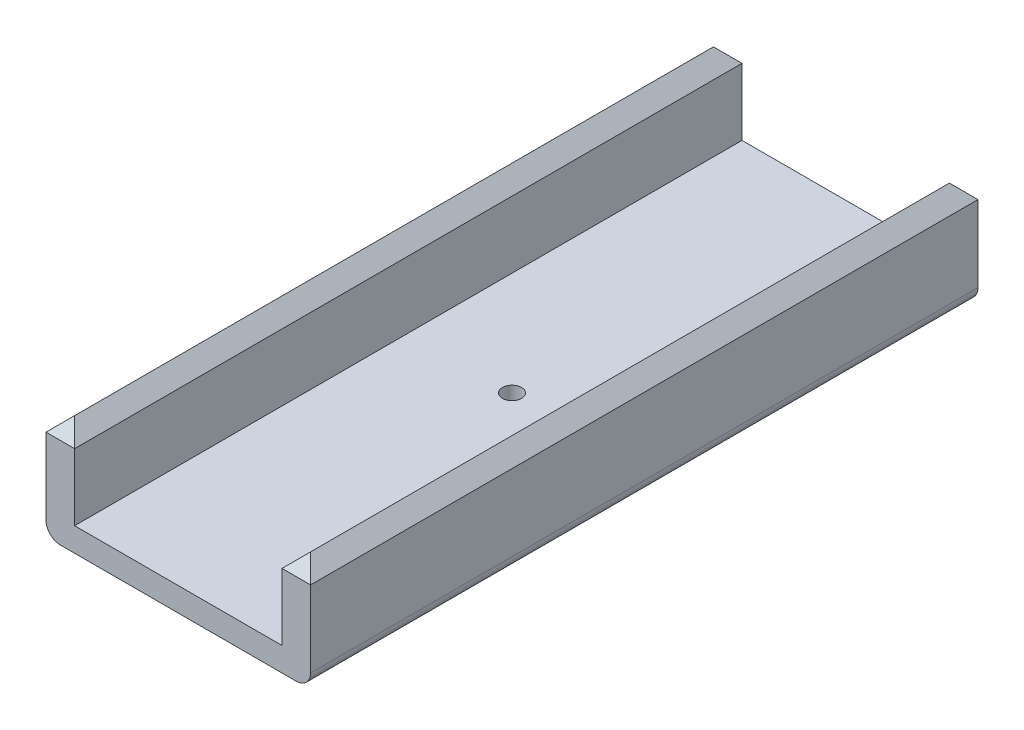
ISO-10303-21;
HEADER;
FILE_DESCRIPTION(('STEP AP214'),'2;1');
FILE_NAME('part.step','',(''),(''),'','','');
FILE_SCHEMA(('AUTOMOTIVE_DESIGN { 1 0 10303 214 1 1 1 1 }'));
ENDSEC;
DATA;
#1=APPLICATION_CONTEXT('core data for automotive mechanical design processes');
#2=APPLICATION_PROTOCOL_DEFINITION('international standard','automotive_design',2000,#1);
#3=PRODUCT_CONTEXT('',#1,'mechanical');
#4=PRODUCT('Part','Part','',(#3));
#5=PRODUCT_RELATED_PRODUCT_CATEGORY('part','',(#4));
#6=PRODUCT_DEFINITION_FORMATION('','',#4);
#7=PRODUCT_DEFINITION_CONTEXT('part definition',#1,'design');
#8=PRODUCT_DEFINITION('design','',#6,#7);
#9=PRODUCT_DEFINITION_SHAPE('','',#8);
#10=(LENGTH_UNIT() NAMED_UNIT(*) SI_UNIT(.MILLI.,.METRE.));
#11=(NAMED_UNIT(*) PLANE_ANGLE_UNIT() SI_UNIT($,.RADIAN.));
#12=(NAMED_UNIT(*) SI_UNIT($,.STERADIAN.) SOLID_ANGLE_UNIT());
#13=UNCERTAINTY_MEASURE_WITH_UNIT(LENGTH_MEASURE(1.E-05),#10,'distance_accuracy_value','');
#14=(GEOMETRIC_REPRESENTATION_CONTEXT(3) GLOBAL_UNCERTAINTY_ASSIGNED_CONTEXT((#13)) GLOBAL_UNIT_ASSIGNED_CONTEXT((#10,
#11,#12)) REPRESENTATION_CONTEXT('',''));
#15=CARTESIAN_POINT('',(0.,0.,0.));
#16=DIRECTION('',(0.,0.,1.));
#17=DIRECTION('',(1.,0.,0.));
#18=AXIS2_PLACEMENT_3D('',#15,#16,#17);
#19=CARTESIAN_POINT('',(-21.75,6.50000000000006,75.));
#20=DIRECTION('',(-0.707106781186547,-0.707106781186548,0.));
#21=DIRECTION('',(0.,0.,1.));
#22=AXIS2_PLACEMENT_3D('',#19,#20,#21);
#23=PLANE('',#22);
#24=DIRECTION('',(0.577350269189626,-0.577350269189625,-0.577350269189626));
#25=VECTOR('',#24,1.);
#26=CARTESIAN_POINT('',(-70.0833333333334,54.8333333333333,-21.6666666666665));
#27=LINE('',#26,#25);
#28=CARTESIAN_POINT('',(-21.75,6.50000000000006,-70.0000000000001));
#29=VERTEX_POINT('',#28);
#30=CARTESIAN_POINT('',(-24.75,9.50000000000006,-66.9999999999999));
#31=VERTEX_POINT('',#30);
#32=EDGE_CURVE('E264',#29,#31,#27,.F.);
#33=ORIENTED_EDGE('',*,*,#32,.T.);
#34=DIRECTION('',(0.,0.,1.));
#35=VECTOR('',#34,1.);
#36=CARTESIAN_POINT('',(-24.75,9.50000000000006,75.));
#37=LINE('',#36,#35);
#38=CARTESIAN_POINT('',(-24.75,9.50000000000006,66.9999999999999));
#39=VERTEX_POINT('',#38);
#40=EDGE_CURVE('E60',#31,#39,#37,.T.);
#41=ORIENTED_EDGE('',*,*,#40,.T.);
#42=DIRECTION('',(0.577350269189626,-0.577350269189625,0.577350269189626));
#43=VECTOR('',#42,1.);
#44=CARTESIAN_POINT('',(-20.0833333333333,4.83333333333336,71.6666666666668));
#45=LINE('',#44,#43);
#46=CARTESIAN_POINT('',(-21.75,6.50000000000006,70.0000000000001));
#47=VERTEX_POINT('',#46);
#48=EDGE_CURVE('E276',#47,#39,#45,.F.);
#49=ORIENTED_EDGE('',*,*,#48,.F.);
#50=DIRECTION('',(0.,0.,1.));
#51=VECTOR('',#50,1.);
#52=CARTESIAN_POINT('',(-21.75,6.50000000000006,75.));
#53=LINE('',#52,#51);
#54=EDGE_CURVE('E260',#29,#47,#53,.T.);
#55=ORIENTED_EDGE('',*,*,#54,.F.);
#56=EDGE_LOOP('',(#33,#41,#49,#55));
#57=FACE_BOUND('',#56,.T.);
#58=ADVANCED_FACE('F50',(#57),#23,.F.);
#59=CARTESIAN_POINT('',(-27.75,12.5,-64.0000000000001));
#60=DIRECTION('',(0.,0.707106781186548,-0.707106781186547));
#61=DIRECTION('',(1.,0.,0.));
#62=AXIS2_PLACEMENT_3D('',#59,#60,#61);
#63=PLANE('',#62);
#64=DIRECTION('',(-0.577350269189626,-0.577350269189625,-0.577350269189626));
#65=VECTOR('',#64,1.);
#66=CARTESIAN_POINT('',(-23.75,10.5,-66.0000000000001));
#67=LINE('',#66,#65);
#68=CARTESIAN_POINT('',(-27.75,6.50000000000006,-70.0000000000001));
#69=VERTEX_POINT('',#68);
#70=EDGE_CURVE('E284',#31,#69,#67,.T.);
#71=ORIENTED_EDGE('',*,*,#70,.F.);
#72=ORIENTED_EDGE('',*,*,#32,.F.);
#73=DIRECTION('',(1.,0.,0.));
#74=VECTOR('',#73,1.);
#75=CARTESIAN_POINT('',(-21.75,6.50000000000006,-70.0000000000001));
#76=LINE('',#75,#74);
#77=EDGE_CURVE('E234',#69,#29,#76,.T.);
#78=ORIENTED_EDGE('',*,*,#77,.F.);
#79=EDGE_LOOP('',(#71,#72,#78));
#80=FACE_BOUND('',#79,.T.);
#81=ADVANCED_FACE('F49',(#80),#63,.T.);
#82=CARTESIAN_POINT('',(-27.75,6.50000000000006,70.0000000000001));
#83=DIRECTION('',(0.707106781186547,-0.707106781186548,0.));
#84=DIRECTION('',(0.,0.,-1.));
#85=AXIS2_PLACEMENT_3D('',#82,#83,#84);
#86=PLANE('',#85);
#87=ORIENTED_EDGE('',*,*,#40,.F.);
#88=ORIENTED_EDGE('',*,*,#70,.T.);
#89=DIRECTION('',(0.,0.,-1.));
#90=VECTOR('',#89,1.);
#91=CARTESIAN_POINT('',(-27.75,6.50000000000006,70.0000000000001));
#92=LINE('',#91,#90);
#93=CARTESIAN_POINT('',(-27.75,6.50000000000006,70.0000000000001));
#94=VERTEX_POINT('',#93);
#95=EDGE_CURVE('E255',#94,#69,#92,.T.);
#96=ORIENTED_EDGE('',*,*,#95,.F.);
#97=DIRECTION('',(0.577350269189626,0.577350269189625,-0.577350269189626));
#98=VECTOR('',#97,1.);
#99=CARTESIAN_POINT('',(-27.75,6.50000000000006,70.0000000000001));
#100=LINE('',#99,#98);
#101=EDGE_CURVE('E277',#39,#94,#100,.F.);
#102=ORIENTED_EDGE('',*,*,#101,.F.);
#103=EDGE_LOOP('',(#87,#88,#96,#102));
#104=FACE_BOUND('',#103,.T.);
#105=ADVANCED_FACE('F291',(#104),#86,.F.);
#106=CARTESIAN_POINT('',(0.,6.50000000000006,70.0000000000001));
#107=DIRECTION('',(0.,-0.707106781186548,-0.707106781186547));
#108=DIRECTION('',(-1.,0.,0.));
#109=AXIS2_PLACEMENT_3D('',#106,#107,#108);
#110=PLANE('',#109);
#111=ORIENTED_EDGE('',*,*,#48,.T.);
#112=ORIENTED_EDGE('',*,*,#101,.T.);
#113=DIRECTION('',(-1.,0.,0.));
#114=VECTOR('',#113,1.);
#115=CARTESIAN_POINT('',(0.,6.50000000000006,70.0000000000001));
#116=LINE('',#115,#114);
#117=EDGE_CURVE('E245',#47,#94,#116,.T.);
#118=ORIENTED_EDGE('',*,*,#117,.F.);
#119=EDGE_LOOP('',(#111,#112,#118));
#120=FACE_BOUND('',#119,.T.);
#121=ADVANCED_FACE('F343',(#120),#110,.F.);
#122=CARTESIAN_POINT('',(21.75,6.50000000000006,75.));
#123=DIRECTION('',(0.707106781186547,-0.707106781186548,0.));
#124=DIRECTION('',(0.,0.,-1.));
#125=AXIS2_PLACEMENT_3D('',#122,#123,#124);
#126=PLANE('',#125);
#127=DIRECTION('',(0.577350269189626,0.577350269189625,-0.577350269189626));
#128=VECTOR('',#127,1.);
#129=CARTESIAN_POINT('',(20.0833333333333,4.83333333333336,71.6666666666668));
#130=LINE('',#129,#128);
#131=CARTESIAN_POINT('',(21.75,6.50000000000006,70.0000000000001));
#132=VERTEX_POINT('',#131);
#133=CARTESIAN_POINT('',(24.75,9.50000000000006,66.9999999999999));
#134=VERTEX_POINT('',#133);
#135=EDGE_CURVE('E268',#132,#134,#130,.T.);
#136=ORIENTED_EDGE('',*,*,#135,.T.);
#137=DIRECTION('',(0.,0.,-1.));
#138=VECTOR('',#137,1.);
#139=CARTESIAN_POINT('',(24.75,9.50000000000006,75.));
#140=LINE('',#139,#138);
#141=CARTESIAN_POINT('',(24.75,9.50000000000006,-66.9999999999999));
#142=VERTEX_POINT('',#141);
#143=EDGE_CURVE('E11',#134,#142,#140,.T.);
#144=ORIENTED_EDGE('',*,*,#143,.T.);
#145=DIRECTION('',(0.577350269189626,0.577350269189625,0.577350269189626));
#146=VECTOR('',#145,1.);
#147=CARTESIAN_POINT('',(70.0833333333334,54.8333333333333,-21.6666666666665));
#148=LINE('',#147,#146);
#149=CARTESIAN_POINT('',(21.75,6.50000000000006,-70.0000000000001));
#150=VERTEX_POINT('',#149);
#151=EDGE_CURVE('E257',#150,#142,#148,.T.);
#152=ORIENTED_EDGE('',*,*,#151,.F.);
#153=DIRECTION('',(0.,0.,-1.));
#154=VECTOR('',#153,1.);
#155=CARTESIAN_POINT('',(21.75,6.50000000000006,75.));
#156=LINE('',#155,#154);
#157=EDGE_CURVE('E253',#132,#150,#156,.T.);
#158=ORIENTED_EDGE('',*,*,#157,.F.);
#159=EDGE_LOOP('',(#136,#144,#152,#158));
#160=FACE_BOUND('',#159,.T.);
#161=ADVANCED_FACE('F329',(#160),#126,.F.);
#162=CARTESIAN_POINT('',(0.,6.50000000000006,70.0000000000001));
#163=DIRECTION('',(0.,-0.707106781186548,-0.707106781186547));
#164=DIRECTION('',(-1.,0.,0.));
#165=AXIS2_PLACEMENT_3D('',#162,#163,#164);
#166=PLANE('',#165);
#167=DIRECTION('',(-0.577350269189626,0.577350269189625,-0.577350269189626));
#168=VECTOR('',#167,1.);
#169=CARTESIAN_POINT('',(18.5,15.75,60.7500000000001));
#170=LINE('',#169,#168);
#171=CARTESIAN_POINT('',(27.75,6.50000000000006,70.0000000000001));
#172=VERTEX_POINT('',#171);
#173=EDGE_CURVE('E275',#134,#172,#170,.F.);
#174=ORIENTED_EDGE('',*,*,#173,.F.);
#175=ORIENTED_EDGE('',*,*,#135,.F.);
#176=DIRECTION('',(-1.,0.,0.));
#177=VECTOR('',#176,1.);
#178=CARTESIAN_POINT('',(0.,6.50000000000006,70.0000000000001));
#179=LINE('',#178,#177);
#180=EDGE_CURVE('E141',#172,#132,#179,.T.);
#181=ORIENTED_EDGE('',*,*,#180,.F.);
#182=EDGE_LOOP('',(#174,#175,#181));
#183=FACE_BOUND('',#182,.T.);
#184=ADVANCED_FACE('F335',(#183),#166,.F.);
#185=CARTESIAN_POINT('',(21.75,12.5,70.0000000000001));
#186=DIRECTION('',(-0.707106781186547,-0.707106781186548,0.));
#187=DIRECTION('',(0.,0.,-1.));
#188=AXIS2_PLACEMENT_3D('',#185,#186,#187);
#189=PLANE('',#188);
#190=ORIENTED_EDGE('',*,*,#143,.F.);
#191=ORIENTED_EDGE('',*,*,#173,.T.);
#192=DIRECTION('',(0.,0.,1.));
#193=VECTOR('',#192,1.);
#194=CARTESIAN_POINT('',(27.75,6.50000000000006,70.0000000000001));
#195=LINE('',#194,#193);
#196=CARTESIAN_POINT('',(27.75,6.50000000000006,-70.0000000000001));
#197=VERTEX_POINT('',#196);
#198=EDGE_CURVE('E242',#197,#172,#195,.T.);
#199=ORIENTED_EDGE('',*,*,#198,.F.);
#200=DIRECTION('',(0.577350269189626,-0.577350269189625,-0.577350269189626));
#201=VECTOR('',#200,1.);
#202=CARTESIAN_POINT('',(-22.9166666666668,57.1666666666666,-19.3333333333332));
#203=LINE('',#202,#201);
#204=EDGE_CURVE('E262',#142,#197,#203,.T.);
#205=ORIENTED_EDGE('',*,*,#204,.F.);
#206=EDGE_LOOP('',(#190,#191,#199,#205));
#207=FACE_BOUND('',#206,.T.);
#208=ADVANCED_FACE('F321',(#207),#189,.F.);
#209=CARTESIAN_POINT('',(-27.75,12.5,-64.0000000000001));
#210=DIRECTION('',(0.,0.707106781186548,-0.707106781186547));
#211=DIRECTION('',(1.,0.,0.));
#212=AXIS2_PLACEMENT_3D('',#209,#210,#211);
#213=PLANE('',#212);
#214=ORIENTED_EDGE('',*,*,#151,.T.);
#215=ORIENTED_EDGE('',*,*,#204,.T.);
#216=DIRECTION('',(1.,0.,0.));
#217=VECTOR('',#216,1.);
#218=CARTESIAN_POINT('',(27.75,6.50000000000006,-70.0000000000001));
#219=LINE('',#218,#217);
#220=EDGE_CURVE('E236',#150,#197,#219,.T.);
#221=ORIENTED_EDGE('',*,*,#220,.F.);
#222=EDGE_LOOP('',(#214,#215,#221));
#223=FACE_BOUND('',#222,.T.);
#224=ADVANCED_FACE('F327',(#223),#213,.T.);
#225=CARTESIAN_POINT('',(27.75,-12.5,70.0000000000001));
#226=DIRECTION('',(-1.,0.,0.));
#227=DIRECTION('',(0.,0.,1.));
#228=AXIS2_PLACEMENT_3D('',#225,#226,#227);
#229=PLANE('',#228);
#230=DIRECTION('',(0.,1.,0.));
#231=VECTOR('',#230,1.);
#232=CARTESIAN_POINT('',(27.75,-12.5,-70.0000000000001));
#233=LINE('',#232,#231);
#234=CARTESIAN_POINT('',(27.75,-9.49999999999995,-70.0000000000001));
#235=VERTEX_POINT('',#234);
#236=EDGE_CURVE('E146',#235,#197,#233,.T.);
#237=ORIENTED_EDGE('',*,*,#236,.T.);
#238=ORIENTED_EDGE('',*,*,#198,.T.);
#239=DIRECTION('',(0.,1.,0.));
#240=VECTOR('',#239,1.);
#241=CARTESIAN_POINT('',(27.75,-12.5,70.0000000000001));
#242=LINE('',#241,#240);
#243=CARTESIAN_POINT('',(27.75,-9.49999999999995,70.0000000000001));
#244=VERTEX_POINT('',#243);
#245=EDGE_CURVE('E180',#244,#172,#242,.T.);
#246=ORIENTED_EDGE('',*,*,#245,.F.);
#247=DIRECTION('',(0.,0.,-1.));
#248=VECTOR('',#247,1.);
#249=CARTESIAN_POINT('',(27.75,-9.49999999999995,70.0000000000001));
#250=LINE('',#249,#248);
#251=EDGE_CURVE('E206',#244,#235,#250,.T.);
#252=ORIENTED_EDGE('',*,*,#251,.T.);
#253=EDGE_LOOP('',(#237,#238,#246,#252));
#254=FACE_BOUND('',#253,.T.);
#255=ADVANCED_FACE('F316',(#254),#229,.F.);
#256=CARTESIAN_POINT('',(-27.75,-12.5,70.0000000000001));
#257=DIRECTION('',(1.,0.,0.));
#258=DIRECTION('',(0.,0.,-1.));
#259=AXIS2_PLACEMENT_3D('',#256,#257,#258);
#260=PLANE('',#259);
#261=DIRECTION('',(0.,-1.,0.));
#262=VECTOR('',#261,1.);
#263=CARTESIAN_POINT('',(-27.75,-12.5,70.0000000000001));
#264=LINE('',#263,#262);
#265=CARTESIAN_POINT('',(-27.75,-9.49999999999995,70.0000000000001));
#266=VERTEX_POINT('',#265);
#267=EDGE_CURVE('E177',#94,#266,#264,.T.);
#268=ORIENTED_EDGE('',*,*,#267,.F.);
#269=ORIENTED_EDGE('',*,*,#95,.T.);
#270=DIRECTION('',(0.,-1.,0.));
#271=VECTOR('',#270,1.);
#272=CARTESIAN_POINT('',(-27.75,-12.5,-70.0000000000001));
#273=LINE('',#272,#271);
#274=CARTESIAN_POINT('',(-27.75,-9.49999999999995,-70.0000000000001));
#275=VERTEX_POINT('',#274);
#276=EDGE_CURVE('E195',#69,#275,#273,.T.);
#277=ORIENTED_EDGE('',*,*,#276,.T.);
#278=DIRECTION('',(0.,0.,-1.));
#279=VECTOR('',#278,1.);
#280=CARTESIAN_POINT('',(-27.75,-9.49999999999995,70.0000000000001));
#281=LINE('',#280,#279);
#282=EDGE_CURVE('E230',#275,#266,#281,.F.);
#283=ORIENTED_EDGE('',*,*,#282,.T.);
#284=EDGE_LOOP('',(#268,#269,#277,#283));
#285=FACE_BOUND('',#284,.T.);
#286=ADVANCED_FACE('F298',(#285),#260,.F.);
#287=CARTESIAN_POINT('',(-27.75,-12.5,70.0000000000001));
#288=DIRECTION('',(0.,1.,0.));
#289=DIRECTION('',(0.,0.,1.));
#290=AXIS2_PLACEMENT_3D('',#287,#288,#289);
#291=PLANE('',#290);
#292=CARTESIAN_POINT('',(0.,-12.5,0.));
#293=DIRECTION('',(0.,1.,0.));
#294=DIRECTION('',(0.,0.,1.));
#295=AXIS2_PLACEMENT_3D('',#292,#293,#294);
#296=CIRCLE('',#295,2.);
#297=CARTESIAN_POINT('',(0.,-12.5,2.));
#298=VERTEX_POINT('',#297);
#299=EDGE_CURVE('E164',#298,#298,#296,.T.);
#300=ORIENTED_EDGE('',*,*,#299,.T.);
#301=EDGE_LOOP('',(#300));
#302=FACE_BOUND('',#301,.T.);
#303=DIRECTION('',(1.,0.,0.));
#304=VECTOR('',#303,1.);
#305=CARTESIAN_POINT('',(-27.75,-12.5,-70.0000000000001));
#306=LINE('',#305,#304);
#307=CARTESIAN_POINT('',(-24.75,-12.5,-70.0000000000001));
#308=VERTEX_POINT('',#307);
#309=CARTESIAN_POINT('',(24.75,-12.5,-70.0000000000001));
#310=VERTEX_POINT('',#309);
#311=EDGE_CURVE('E182',#308,#310,#306,.T.);
#312=ORIENTED_EDGE('',*,*,#311,.T.);
#313=DIRECTION('',(0.,0.,-1.));
#314=VECTOR('',#313,1.);
#315=CARTESIAN_POINT('',(24.75,-12.5,70.0000000000001));
#316=LINE('',#315,#314);
#317=CARTESIAN_POINT('',(24.75,-12.5,70.0000000000001));
#318=VERTEX_POINT('',#317);
#319=EDGE_CURVE('E222',#310,#318,#316,.F.);
#320=ORIENTED_EDGE('',*,*,#319,.T.);
#321=DIRECTION('',(1.,0.,0.));
#322=VECTOR('',#321,1.);
#323=CARTESIAN_POINT('',(-27.75,-12.5,70.0000000000001));
#324=LINE('',#323,#322);
#325=CARTESIAN_POINT('',(-24.75,-12.5,70.0000000000001));
#326=VERTEX_POINT('',#325);
#327=EDGE_CURVE('E184',#326,#318,#324,.T.);
#328=ORIENTED_EDGE('',*,*,#327,.F.);
#329=DIRECTION('',(0.,0.,-1.));
#330=VECTOR('',#329,1.);
#331=CARTESIAN_POINT('',(-24.75,-12.5,70.0000000000001));
#332=LINE('',#331,#330);
#333=EDGE_CURVE('E220',#326,#308,#332,.T.);
#334=ORIENTED_EDGE('',*,*,#333,.T.);
#335=EDGE_LOOP('',(#312,#320,#328,#334));
#336=FACE_BOUND('',#335,.T.);
#337=ADVANCED_FACE('F306',(#302,#336),#291,.F.);
#338=CARTESIAN_POINT('',(0.,0.,70.0000000000001));
#339=DIRECTION('',(0.,0.,-1.));
#340=DIRECTION('',(-1.,0.,0.));
#341=AXIS2_PLACEMENT_3D('',#338,#339,#340);
#342=PLANE('',#341);
#343=ORIENTED_EDGE('',*,*,#245,.T.);
#344=ORIENTED_EDGE('',*,*,#180,.T.);
#345=DIRECTION('',(0.,-1.,0.));
#346=VECTOR('',#345,1.);
#347=CARTESIAN_POINT('',(21.75,0.,70.0000000000001));
#348=LINE('',#347,#346);
#349=CARTESIAN_POINT('',(21.75,-7.49999999999995,70.0000000000001));
#350=VERTEX_POINT('',#349);
#351=EDGE_CURVE('E138',#132,#350,#348,.T.);
#352=ORIENTED_EDGE('',*,*,#351,.T.);
#353=DIRECTION('',(-1.,0.,0.));
#354=VECTOR('',#353,1.);
#355=CARTESIAN_POINT('',(0.,-7.49999999999995,70.0000000000001));
#356=LINE('',#355,#354);
#357=CARTESIAN_POINT('',(-21.75,-7.49999999999995,70.0000000000001));
#358=VERTEX_POINT('',#357);
#359=EDGE_CURVE('E143',#350,#358,#356,.T.);
#360=ORIENTED_EDGE('',*,*,#359,.T.);
#361=DIRECTION('',(0.,1.,0.));
#362=VECTOR('',#361,1.);
#363=CARTESIAN_POINT('',(-21.75,0.,70.0000000000001));
#364=LINE('',#363,#362);
#365=EDGE_CURVE('E149',#358,#47,#364,.T.);
#366=ORIENTED_EDGE('',*,*,#365,.T.);
#367=ORIENTED_EDGE('',*,*,#117,.T.);
#368=ORIENTED_EDGE('',*,*,#267,.T.);
#369=CARTESIAN_POINT('',(-24.75,-9.49999999999995,70.0000000000001));
#370=DIRECTION('',(0.,0.,-1.));
#371=DIRECTION('',(-1.,0.,0.));
#372=AXIS2_PLACEMENT_3D('',#369,#370,#371);
#373=CIRCLE('',#372,3.);
#374=EDGE_CURVE('E221',#266,#326,#373,.F.);
#375=ORIENTED_EDGE('',*,*,#374,.T.);
#376=ORIENTED_EDGE('',*,*,#327,.T.);
#377=CARTESIAN_POINT('',(24.75,-9.49999999999995,70.0000000000001));
#378=DIRECTION('',(0.,0.,-1.));
#379=DIRECTION('',(-1.,0.,0.));
#380=AXIS2_PLACEMENT_3D('',#377,#378,#379);
#381=CIRCLE('',#380,3.);
#382=EDGE_CURVE('E227',#318,#244,#381,.F.);
#383=ORIENTED_EDGE('',*,*,#382,.T.);
#384=EDGE_LOOP('',(#343,#344,#352,#360,#366,#367,#368,#375,#376,#383));
#385=FACE_BOUND('',#384,.T.);
#386=ADVANCED_FACE('F139',(#385),#342,.F.);
#387=CARTESIAN_POINT('',(0.,0.,-70.0000000000001));
#388=DIRECTION('',(0.,0.,-1.));
#389=DIRECTION('',(-1.,0.,0.));
#390=AXIS2_PLACEMENT_3D('',#387,#388,#389);
#391=PLANE('',#390);
#392=DIRECTION('',(0.,-1.,0.));
#393=VECTOR('',#392,1.);
#394=CARTESIAN_POINT('',(21.75,0.,-70.0000000000001));
#395=LINE('',#394,#393);
#396=CARTESIAN_POINT('',(21.75,-7.49999999999995,-70.0000000000001));
#397=VERTEX_POINT('',#396);
#398=EDGE_CURVE('E162',#150,#397,#395,.T.);
#399=ORIENTED_EDGE('',*,*,#398,.F.);
#400=ORIENTED_EDGE('',*,*,#220,.T.);
#401=ORIENTED_EDGE('',*,*,#236,.F.);
#402=CARTESIAN_POINT('',(24.75,-9.49999999999995,-70.0000000000001));
#403=DIRECTION('',(0.,0.,-1.));
#404=DIRECTION('',(-1.,0.,0.));
#405=AXIS2_PLACEMENT_3D('',#402,#403,#404);
#406=CIRCLE('',#405,3.);
#407=EDGE_CURVE('E212',#235,#310,#406,.T.);
#408=ORIENTED_EDGE('',*,*,#407,.T.);
#409=ORIENTED_EDGE('',*,*,#311,.F.);
#410=CARTESIAN_POINT('',(-24.75,-9.49999999999995,-70.0000000000001));
#411=DIRECTION('',(0.,0.,-1.));
#412=DIRECTION('',(-1.,0.,0.));
#413=AXIS2_PLACEMENT_3D('',#410,#411,#412);
#414=CIRCLE('',#413,3.);
#415=EDGE_CURVE('E209',#308,#275,#414,.T.);
#416=ORIENTED_EDGE('',*,*,#415,.T.);
#417=ORIENTED_EDGE('',*,*,#276,.F.);
#418=ORIENTED_EDGE('',*,*,#77,.T.);
#419=DIRECTION('',(0.,1.,0.));
#420=VECTOR('',#419,1.);
#421=CARTESIAN_POINT('',(-21.75,0.,-70.0000000000001));
#422=LINE('',#421,#420);
#423=CARTESIAN_POINT('',(-21.75,-7.49999999999995,-70.0000000000001));
#424=VERTEX_POINT('',#423);
#425=EDGE_CURVE('E199',#424,#29,#422,.T.);
#426=ORIENTED_EDGE('',*,*,#425,.F.);
#427=DIRECTION('',(-1.,0.,0.));
#428=VECTOR('',#427,1.);
#429=CARTESIAN_POINT('',(0.,-7.49999999999995,-70.0000000000001));
#430=LINE('',#429,#428);
#431=EDGE_CURVE('E189',#397,#424,#430,.T.);
#432=ORIENTED_EDGE('',*,*,#431,.F.);
#433=EDGE_LOOP('',(#399,#400,#401,#408,#409,#416,#417,#418,#426,#432));
#434=FACE_BOUND('',#433,.T.);
#435=ADVANCED_FACE('F324',(#434),#391,.T.);
#436=CARTESIAN_POINT('',(21.75,-7.49999999999995,75.));
#437=DIRECTION('',(1.,0.,0.));
#438=DIRECTION('',(0.,0.,-1.));
#439=AXIS2_PLACEMENT_3D('',#436,#437,#438);
#440=PLANE('',#439);
#441=ORIENTED_EDGE('',*,*,#351,.F.);
#442=ORIENTED_EDGE('',*,*,#157,.T.);
#443=ORIENTED_EDGE('',*,*,#398,.T.);
#444=DIRECTION('',(0.,0.,-1.));
#445=VECTOR('',#444,1.);
#446=CARTESIAN_POINT('',(21.75,-7.49999999999995,75.));
#447=LINE('',#446,#445);
#448=EDGE_CURVE('E154',#350,#397,#447,.T.);
#449=ORIENTED_EDGE('',*,*,#448,.F.);
#450=EDGE_LOOP('',(#441,#442,#443,#449));
#451=FACE_BOUND('',#450,.T.);
#452=ADVANCED_FACE('F161',(#451),#440,.F.);
#453=CARTESIAN_POINT('',(-21.75,-7.49999999999995,75.));
#454=DIRECTION('',(-1.,0.,0.));
#455=DIRECTION('',(0.,0.,1.));
#456=AXIS2_PLACEMENT_3D('',#453,#454,#455);
#457=PLANE('',#456);
#458=ORIENTED_EDGE('',*,*,#425,.T.);
#459=ORIENTED_EDGE('',*,*,#54,.T.);
#460=ORIENTED_EDGE('',*,*,#365,.F.);
#461=DIRECTION('',(0.,0.,1.));
#462=VECTOR('',#461,1.);
#463=CARTESIAN_POINT('',(-21.75,-7.49999999999995,75.));
#464=LINE('',#463,#462);
#465=EDGE_CURVE('E158',#424,#358,#464,.T.);
#466=ORIENTED_EDGE('',*,*,#465,.F.);
#467=EDGE_LOOP('',(#458,#459,#460,#466));
#468=FACE_BOUND('',#467,.T.);
#469=ADVANCED_FACE('F414',(#468),#457,.F.);
#470=CARTESIAN_POINT('',(0.,-7.49999999999995,0.));
#471=DIRECTION('',(0.,-1.,0.));
#472=DIRECTION('',(0.,0.,-1.));
#473=AXIS2_PLACEMENT_3D('',#470,#471,#472);
#474=PLANE('',#473);
#475=CARTESIAN_POINT('',(0.,-7.49999999999995,0.));
#476=DIRECTION('',(0.,1.,0.));
#477=DIRECTION('',(0.,0.,1.));
#478=AXIS2_PLACEMENT_3D('',#475,#476,#477);
#479=CIRCLE('',#478,2.);
#480=CARTESIAN_POINT('',(0.,-7.49999999999995,2.));
#481=VERTEX_POINT('',#480);
#482=EDGE_CURVE('E171',#481,#481,#479,.T.);
#483=ORIENTED_EDGE('',*,*,#482,.F.);
#484=EDGE_LOOP('',(#483));
#485=FACE_BOUND('',#484,.T.);
#486=ORIENTED_EDGE('',*,*,#448,.T.);
#487=ORIENTED_EDGE('',*,*,#431,.T.);
#488=ORIENTED_EDGE('',*,*,#465,.T.);
#489=ORIENTED_EDGE('',*,*,#359,.F.);
#490=EDGE_LOOP('',(#486,#487,#488,#489));
#491=FACE_BOUND('',#490,.T.);
#492=ADVANCED_FACE('F152',(#485,#491),#474,.F.);
#493=CARTESIAN_POINT('',(0.,-12.5,0.));
#494=DIRECTION('',(0.,1.,0.));
#495=DIRECTION('',(0.,0.,1.));
#496=AXIS2_PLACEMENT_3D('',#493,#494,#495);
#497=CYLINDRICAL_SURFACE('',#496,2.);
#498=ORIENTED_EDGE('',*,*,#299,.F.);
#499=EDGE_LOOP('',(#498));
#500=FACE_BOUND('',#499,.T.);
#501=ORIENTED_EDGE('',*,*,#482,.T.);
#502=EDGE_LOOP('',(#501));
#503=FACE_BOUND('',#502,.T.);
#504=ADVANCED_FACE('F402',(#500,#503),#497,.F.);
#505=CARTESIAN_POINT('',(24.75,-9.49999999999995,70.0000000000001));
#506=DIRECTION('',(0.,0.,-1.));
#507=DIRECTION('',(-1.,0.,0.));
#508=AXIS2_PLACEMENT_3D('',#505,#506,#507);
#509=CYLINDRICAL_SURFACE('',#508,3.);
#510=ORIENTED_EDGE('',*,*,#382,.F.);
#511=ORIENTED_EDGE('',*,*,#319,.F.);
#512=ORIENTED_EDGE('',*,*,#407,.F.);
#513=ORIENTED_EDGE('',*,*,#251,.F.);
#514=EDGE_LOOP('',(#510,#511,#512,#513));
#515=FACE_BOUND('',#514,.T.);
#516=ADVANCED_FACE('F315',(#515),#509,.T.);
#517=CARTESIAN_POINT('',(-24.75,-9.49999999999995,70.0000000000001));
#518=DIRECTION('',(0.,0.,-1.));
#519=DIRECTION('',(-1.,0.,0.));
#520=AXIS2_PLACEMENT_3D('',#517,#518,#519);
#521=CYLINDRICAL_SURFACE('',#520,3.);
#522=ORIENTED_EDGE('',*,*,#374,.F.);
#523=ORIENTED_EDGE('',*,*,#282,.F.);
#524=ORIENTED_EDGE('',*,*,#415,.F.);
#525=ORIENTED_EDGE('',*,*,#333,.F.);
#526=EDGE_LOOP('',(#522,#523,#524,#525));
#527=FACE_BOUND('',#526,.T.);
#528=ADVANCED_FACE('F304',(#527),#521,.T.);
#529=CLOSED_SHELL('',(#58,#81,#105,#121,#161,#184,#208,#224,#255,#286,#337,#386,#435,#452,#469,
#492,#504,#516,#528));
#530=MANIFOLD_SOLID_BREP('B2',#529);
#531=ADVANCED_BREP_SHAPE_REPRESENTATION('',(#18,#530),#14);
#532=SHAPE_DEFINITION_REPRESENTATION(#9,#531);
ENDSEC;
END-ISO-10303-21;
